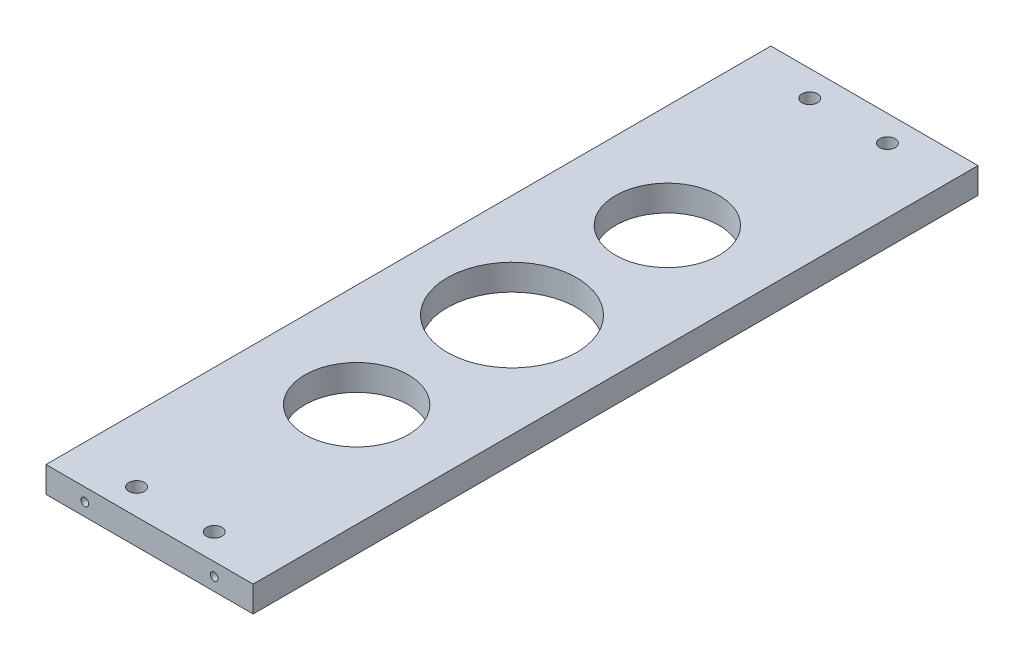
ISO-10303-21;
HEADER;
FILE_DESCRIPTION(('STEP AP214'),'2;1');
FILE_NAME('part.step','',(''),(''),'','','');
FILE_SCHEMA(('AUTOMOTIVE_DESIGN { 1 0 10303 214 1 1 1 1 }'));
ENDSEC;
DATA;
#1=APPLICATION_CONTEXT('core data for automotive mechanical design processes');
#2=APPLICATION_PROTOCOL_DEFINITION('international standard','automotive_design',2000,#1);
#3=PRODUCT_CONTEXT('',#1,'mechanical');
#4=PRODUCT('Part','Part','',(#3));
#5=PRODUCT_RELATED_PRODUCT_CATEGORY('part','',(#4));
#6=PRODUCT_DEFINITION_FORMATION('','',#4);
#7=PRODUCT_DEFINITION_CONTEXT('part definition',#1,'design');
#8=PRODUCT_DEFINITION('design','',#6,#7);
#9=PRODUCT_DEFINITION_SHAPE('','',#8);
#10=(LENGTH_UNIT() NAMED_UNIT(*) SI_UNIT(.MILLI.,.METRE.));
#11=(NAMED_UNIT(*) PLANE_ANGLE_UNIT() SI_UNIT($,.RADIAN.));
#12=(NAMED_UNIT(*) SI_UNIT($,.STERADIAN.) SOLID_ANGLE_UNIT());
#13=UNCERTAINTY_MEASURE_WITH_UNIT(LENGTH_MEASURE(1.E-05),#10,'distance_accuracy_value','');
#14=(GEOMETRIC_REPRESENTATION_CONTEXT(3) GLOBAL_UNCERTAINTY_ASSIGNED_CONTEXT((#13)) GLOBAL_UNIT_ASSIGNED_CONTEXT((#10,
#11,#12)) REPRESENTATION_CONTEXT('',''));
#15=CARTESIAN_POINT('',(0.,0.,0.));
#16=DIRECTION('',(0.,0.,1.));
#17=DIRECTION('',(1.,0.,0.));
#18=AXIS2_PLACEMENT_3D('',#15,#16,#17);
#19=CARTESIAN_POINT('',(0.,10.,-140.));
#20=DIRECTION('',(0.,0.,1.));
#21=DIRECTION('',(1.,0.,0.));
#22=AXIS2_PLACEMENT_3D('',#19,#20,#21);
#23=PLANE('',#22);
#24=CARTESIAN_POINT('',(15.,5.,-140.));
#25=DIRECTION('',(0.,0.,1.));
#26=DIRECTION('',(1.,0.,0.));
#27=AXIS2_PLACEMENT_3D('',#24,#25,#26);
#28=CIRCLE('',#27,1.5);
#29=CARTESIAN_POINT('',(16.5,5.,-140.));
#30=VERTEX_POINT('',#29);
#31=EDGE_CURVE('E222',#30,#30,#28,.T.);
#32=ORIENTED_EDGE('',*,*,#31,.T.);
#33=EDGE_LOOP('',(#32));
#34=FACE_BOUND('',#33,.T.);
#35=DIRECTION('',(-1.,0.,0.));
#36=VECTOR('',#35,1.);
#37=CARTESIAN_POINT('',(0.,0.,-140.));
#38=LINE('',#37,#36);
#39=CARTESIAN_POINT('',(80.,0.,-140.));
#40=VERTEX_POINT('',#39);
#41=CARTESIAN_POINT('',(0.,0.,-140.));
#42=VERTEX_POINT('',#41);
#43=EDGE_CURVE('E101',#40,#42,#38,.T.);
#44=ORIENTED_EDGE('',*,*,#43,.T.);
#45=DIRECTION('',(0.,-1.,0.));
#46=VECTOR('',#45,1.);
#47=CARTESIAN_POINT('',(0.,10.,-140.));
#48=LINE('',#47,#46);
#49=CARTESIAN_POINT('',(0.,10.,-140.));
#50=VERTEX_POINT('',#49);
#51=EDGE_CURVE('E93',#50,#42,#48,.T.);
#52=ORIENTED_EDGE('',*,*,#51,.F.);
#53=DIRECTION('',(-1.,0.,0.));
#54=VECTOR('',#53,1.);
#55=CARTESIAN_POINT('',(0.,10.,-140.));
#56=LINE('',#55,#54);
#57=CARTESIAN_POINT('',(80.,10.,-140.));
#58=VERTEX_POINT('',#57);
#59=EDGE_CURVE('E48',#58,#50,#56,.T.);
#60=ORIENTED_EDGE('',*,*,#59,.F.);
#61=DIRECTION('',(0.,-1.,0.));
#62=VECTOR('',#61,1.);
#63=CARTESIAN_POINT('',(80.,10.,-140.));
#64=LINE('',#63,#62);
#65=EDGE_CURVE('E90',#58,#40,#64,.T.);
#66=ORIENTED_EDGE('',*,*,#65,.T.);
#67=EDGE_LOOP('',(#44,#52,#60,#66));
#68=FACE_BOUND('',#67,.T.);
#69=CARTESIAN_POINT('',(65.,5.,-140.));
#70=DIRECTION('',(0.,0.,1.));
#71=DIRECTION('',(1.,0.,0.));
#72=AXIS2_PLACEMENT_3D('',#69,#70,#71);
#73=CIRCLE('',#72,1.5);
#74=CARTESIAN_POINT('',(66.5,5.,-140.));
#75=VERTEX_POINT('',#74);
#76=EDGE_CURVE('E227',#75,#75,#73,.T.);
#77=ORIENTED_EDGE('',*,*,#76,.T.);
#78=EDGE_LOOP('',(#77));
#79=FACE_BOUND('',#78,.T.);
#80=ADVANCED_FACE('F31',(#34,#68,#79),#23,.F.);
#81=CARTESIAN_POINT('',(-3.89437682128858E-13,10.,140.));
#82=DIRECTION('',(0.,1.,0.));
#83=DIRECTION('',(0.,0.,1.));
#84=AXIS2_PLACEMENT_3D('',#81,#82,#83);
#85=PLANE('',#84);
#86=CARTESIAN_POINT('',(40.,10.,60.));
#87=DIRECTION('',(0.,1.,0.));
#88=DIRECTION('',(0.,0.,1.));
#89=AXIS2_PLACEMENT_3D('',#86,#87,#88);
#90=CIRCLE('',#89,20.);
#91=CARTESIAN_POINT('',(40.,10.,80.));
#92=VERTEX_POINT('',#91);
#93=EDGE_CURVE('E139',#92,#92,#90,.T.);
#94=ORIENTED_EDGE('',*,*,#93,.F.);
#95=EDGE_LOOP('',(#94));
#96=FACE_BOUND('',#95,.T.);
#97=CARTESIAN_POINT('',(55.,10.,130.));
#98=DIRECTION('',(0.,1.,0.));
#99=DIRECTION('',(0.,0.,1.));
#100=AXIS2_PLACEMENT_3D('',#97,#98,#99);
#101=CIRCLE('',#100,3.);
#102=CARTESIAN_POINT('',(55.,10.,133.));
#103=VERTEX_POINT('',#102);
#104=EDGE_CURVE('E149',#103,#103,#101,.T.);
#105=ORIENTED_EDGE('',*,*,#104,.F.);
#106=EDGE_LOOP('',(#105));
#107=FACE_BOUND('',#106,.T.);
#108=CARTESIAN_POINT('',(55.,10.,-130.));
#109=DIRECTION('',(0.,1.,0.));
#110=DIRECTION('',(0.,0.,1.));
#111=AXIS2_PLACEMENT_3D('',#108,#109,#110);
#112=CIRCLE('',#111,3.);
#113=CARTESIAN_POINT('',(55.,10.,-127.));
#114=VERTEX_POINT('',#113);
#115=EDGE_CURVE('E159',#114,#114,#112,.T.);
#116=ORIENTED_EDGE('',*,*,#115,.F.);
#117=EDGE_LOOP('',(#116));
#118=FACE_BOUND('',#117,.T.);
#119=DIRECTION('',(0.,0.,1.));
#120=VECTOR('',#119,1.);
#121=CARTESIAN_POINT('',(0.,10.,-140.));
#122=LINE('',#121,#120);
#123=CARTESIAN_POINT('',(0.,10.,140.));
#124=VERTEX_POINT('',#123);
#125=EDGE_CURVE('E76',#50,#124,#122,.T.);
#126=ORIENTED_EDGE('',*,*,#125,.T.);
#127=DIRECTION('',(1.,0.,0.));
#128=VECTOR('',#127,1.);
#129=CARTESIAN_POINT('',(0.,10.,140.));
#130=LINE('',#129,#128);
#131=CARTESIAN_POINT('',(80.0000000000001,10.,140.));
#132=VERTEX_POINT('',#131);
#133=EDGE_CURVE('E79',#124,#132,#130,.T.);
#134=ORIENTED_EDGE('',*,*,#133,.T.);
#135=DIRECTION('',(0.,0.,-1.));
#136=VECTOR('',#135,1.);
#137=CARTESIAN_POINT('',(80.0000000000001,10.,110.));
#138=LINE('',#137,#136);
#139=EDGE_CURVE('E84',#132,#58,#138,.T.);
#140=ORIENTED_EDGE('',*,*,#139,.T.);
#141=ORIENTED_EDGE('',*,*,#59,.T.);
#142=EDGE_LOOP('',(#126,#134,#140,#141));
#143=FACE_BOUND('',#142,.T.);
#144=CARTESIAN_POINT('',(25.,10.,-130.));
#145=DIRECTION('',(0.,1.,0.));
#146=DIRECTION('',(0.,0.,1.));
#147=AXIS2_PLACEMENT_3D('',#144,#145,#146);
#148=CIRCLE('',#147,3.);
#149=CARTESIAN_POINT('',(25.,10.,-127.));
#150=VERTEX_POINT('',#149);
#151=EDGE_CURVE('E98',#150,#150,#148,.T.);
#152=ORIENTED_EDGE('',*,*,#151,.F.);
#153=EDGE_LOOP('',(#152));
#154=FACE_BOUND('',#153,.T.);
#155=CARTESIAN_POINT('',(25.,10.,130.));
#156=DIRECTION('',(0.,1.,0.));
#157=DIRECTION('',(0.,0.,1.));
#158=AXIS2_PLACEMENT_3D('',#155,#156,#157);
#159=CIRCLE('',#158,3.);
#160=CARTESIAN_POINT('',(25.,10.,133.));
#161=VERTEX_POINT('',#160);
#162=EDGE_CURVE('E154',#161,#161,#159,.T.);
#163=ORIENTED_EDGE('',*,*,#162,.F.);
#164=EDGE_LOOP('',(#163));
#165=FACE_BOUND('',#164,.T.);
#166=CARTESIAN_POINT('',(40.,10.,0.));
#167=DIRECTION('',(0.,1.,0.));
#168=DIRECTION('',(0.,0.,1.));
#169=AXIS2_PLACEMENT_3D('',#166,#167,#168);
#170=CIRCLE('',#169,25.);
#171=CARTESIAN_POINT('',(40.,10.,25.));
#172=VERTEX_POINT('',#171);
#173=EDGE_CURVE('E144',#172,#172,#170,.T.);
#174=ORIENTED_EDGE('',*,*,#173,.F.);
#175=EDGE_LOOP('',(#174));
#176=FACE_BOUND('',#175,.T.);
#177=CARTESIAN_POINT('',(40.,10.,-60.));
#178=DIRECTION('',(0.,1.,0.));
#179=DIRECTION('',(0.,0.,1.));
#180=AXIS2_PLACEMENT_3D('',#177,#178,#179);
#181=CIRCLE('',#180,20.);
#182=CARTESIAN_POINT('',(40.,10.,-40.));
#183=VERTEX_POINT('',#182);
#184=EDGE_CURVE('E128',#183,#183,#181,.T.);
#185=ORIENTED_EDGE('',*,*,#184,.F.);
#186=EDGE_LOOP('',(#185));
#187=FACE_BOUND('',#186,.T.);
#188=ADVANCED_FACE('F81',(#96,#107,#118,#143,#154,#165,#176,#187),#85,.T.);
#189=CARTESIAN_POINT('',(-3.89437682128858E-13,0.,140.));
#190=DIRECTION('',(0.,1.,0.));
#191=DIRECTION('',(0.,0.,1.));
#192=AXIS2_PLACEMENT_3D('',#189,#190,#191);
#193=PLANE('',#192);
#194=CARTESIAN_POINT('',(40.,0.,60.));
#195=DIRECTION('',(0.,1.,0.));
#196=DIRECTION('',(0.,0.,1.));
#197=AXIS2_PLACEMENT_3D('',#194,#195,#196);
#198=CIRCLE('',#197,20.);
#199=CARTESIAN_POINT('',(40.,0.,80.));
#200=VERTEX_POINT('',#199);
#201=EDGE_CURVE('E132',#200,#200,#198,.T.);
#202=ORIENTED_EDGE('',*,*,#201,.T.);
#203=EDGE_LOOP('',(#202));
#204=FACE_BOUND('',#203,.T.);
#205=CARTESIAN_POINT('',(55.,0.,130.));
#206=DIRECTION('',(0.,1.,0.));
#207=DIRECTION('',(0.,0.,1.));
#208=AXIS2_PLACEMENT_3D('',#205,#206,#207);
#209=CIRCLE('',#208,3.);
#210=CARTESIAN_POINT('',(55.,0.,133.));
#211=VERTEX_POINT('',#210);
#212=EDGE_CURVE('E147',#211,#211,#209,.T.);
#213=ORIENTED_EDGE('',*,*,#212,.T.);
#214=EDGE_LOOP('',(#213));
#215=FACE_BOUND('',#214,.T.);
#216=CARTESIAN_POINT('',(55.,0.,-130.));
#217=DIRECTION('',(0.,1.,0.));
#218=DIRECTION('',(0.,0.,1.));
#219=AXIS2_PLACEMENT_3D('',#216,#217,#218);
#220=CIRCLE('',#219,3.);
#221=CARTESIAN_POINT('',(55.,0.,-127.));
#222=VERTEX_POINT('',#221);
#223=EDGE_CURVE('E157',#222,#222,#220,.T.);
#224=ORIENTED_EDGE('',*,*,#223,.T.);
#225=EDGE_LOOP('',(#224));
#226=FACE_BOUND('',#225,.T.);
#227=DIRECTION('',(0.,0.,1.));
#228=VECTOR('',#227,1.);
#229=CARTESIAN_POINT('',(0.,0.,110.));
#230=LINE('',#229,#228);
#231=CARTESIAN_POINT('',(0.,0.,140.));
#232=VERTEX_POINT('',#231);
#233=EDGE_CURVE('E71',#42,#232,#230,.T.);
#234=ORIENTED_EDGE('',*,*,#233,.F.);
#235=ORIENTED_EDGE('',*,*,#43,.F.);
#236=DIRECTION('',(0.,0.,-1.));
#237=VECTOR('',#236,1.);
#238=CARTESIAN_POINT('',(80.,0.,-140.));
#239=LINE('',#238,#237);
#240=CARTESIAN_POINT('',(80.0000000000001,0.,140.));
#241=VERTEX_POINT('',#240);
#242=EDGE_CURVE('E64',#241,#40,#239,.T.);
#243=ORIENTED_EDGE('',*,*,#242,.F.);
#244=DIRECTION('',(1.,0.,0.));
#245=VECTOR('',#244,1.);
#246=CARTESIAN_POINT('',(0.,0.,140.));
#247=LINE('',#246,#245);
#248=EDGE_CURVE('E89',#232,#241,#247,.T.);
#249=ORIENTED_EDGE('',*,*,#248,.F.);
#250=EDGE_LOOP('',(#234,#235,#243,#249));
#251=FACE_BOUND('',#250,.T.);
#252=CARTESIAN_POINT('',(25.,0.,-130.));
#253=DIRECTION('',(0.,1.,0.));
#254=DIRECTION('',(0.,0.,1.));
#255=AXIS2_PLACEMENT_3D('',#252,#253,#254);
#256=CIRCLE('',#255,3.);
#257=CARTESIAN_POINT('',(25.,0.,-127.));
#258=VERTEX_POINT('',#257);
#259=EDGE_CURVE('E115',#258,#258,#256,.T.);
#260=ORIENTED_EDGE('',*,*,#259,.T.);
#261=EDGE_LOOP('',(#260));
#262=FACE_BOUND('',#261,.T.);
#263=CARTESIAN_POINT('',(25.,0.,130.));
#264=DIRECTION('',(0.,1.,0.));
#265=DIRECTION('',(0.,0.,1.));
#266=AXIS2_PLACEMENT_3D('',#263,#264,#265);
#267=CIRCLE('',#266,3.);
#268=CARTESIAN_POINT('',(25.,0.,133.));
#269=VERTEX_POINT('',#268);
#270=EDGE_CURVE('E119',#269,#269,#267,.T.);
#271=ORIENTED_EDGE('',*,*,#270,.T.);
#272=EDGE_LOOP('',(#271));
#273=FACE_BOUND('',#272,.T.);
#274=CARTESIAN_POINT('',(40.,0.,0.));
#275=DIRECTION('',(0.,1.,0.));
#276=DIRECTION('',(0.,0.,1.));
#277=AXIS2_PLACEMENT_3D('',#274,#275,#276);
#278=CIRCLE('',#277,25.);
#279=CARTESIAN_POINT('',(40.,0.,25.));
#280=VERTEX_POINT('',#279);
#281=EDGE_CURVE('E123',#280,#280,#278,.T.);
#282=ORIENTED_EDGE('',*,*,#281,.T.);
#283=EDGE_LOOP('',(#282));
#284=FACE_BOUND('',#283,.T.);
#285=CARTESIAN_POINT('',(40.,0.,-60.));
#286=DIRECTION('',(0.,1.,0.));
#287=DIRECTION('',(0.,0.,1.));
#288=AXIS2_PLACEMENT_3D('',#285,#286,#287);
#289=CIRCLE('',#288,20.);
#290=CARTESIAN_POINT('',(40.,0.,-40.));
#291=VERTEX_POINT('',#290);
#292=EDGE_CURVE('E126',#291,#291,#289,.T.);
#293=ORIENTED_EDGE('',*,*,#292,.T.);
#294=EDGE_LOOP('',(#293));
#295=FACE_BOUND('',#294,.T.);
#296=ADVANCED_FACE('F107',(#204,#215,#226,#251,#262,#273,#284,#295),#193,.F.);
#297=CARTESIAN_POINT('',(0.,10.,110.));
#298=DIRECTION('',(1.,0.,0.));
#299=DIRECTION('',(0.,0.,-1.));
#300=AXIS2_PLACEMENT_3D('',#297,#298,#299);
#301=PLANE('',#300);
#302=ORIENTED_EDGE('',*,*,#233,.T.);
#303=DIRECTION('',(0.,-1.,0.));
#304=VECTOR('',#303,1.);
#305=CARTESIAN_POINT('',(0.,10.,140.));
#306=LINE('',#305,#304);
#307=EDGE_CURVE('E11',#124,#232,#306,.T.);
#308=ORIENTED_EDGE('',*,*,#307,.F.);
#309=ORIENTED_EDGE('',*,*,#125,.F.);
#310=ORIENTED_EDGE('',*,*,#51,.T.);
#311=EDGE_LOOP('',(#302,#308,#309,#310));
#312=FACE_BOUND('',#311,.T.);
#313=ADVANCED_FACE('F33',(#312),#301,.F.);
#314=CARTESIAN_POINT('',(0.,10.,140.));
#315=DIRECTION('',(0.,0.,-1.));
#316=DIRECTION('',(-1.,0.,0.));
#317=AXIS2_PLACEMENT_3D('',#314,#315,#316);
#318=PLANE('',#317);
#319=CARTESIAN_POINT('',(65.,5.,140.));
#320=DIRECTION('',(0.,0.,1.));
#321=DIRECTION('',(1.,0.,0.));
#322=AXIS2_PLACEMENT_3D('',#319,#320,#321);
#323=CIRCLE('',#322,1.5);
#324=CARTESIAN_POINT('',(66.5,5.,140.));
#325=VERTEX_POINT('',#324);
#326=EDGE_CURVE('E212',#325,#325,#323,.T.);
#327=ORIENTED_EDGE('',*,*,#326,.F.);
#328=EDGE_LOOP('',(#327));
#329=FACE_BOUND('',#328,.T.);
#330=CARTESIAN_POINT('',(15.,5.,140.));
#331=DIRECTION('',(0.,0.,1.));
#332=DIRECTION('',(1.,0.,0.));
#333=AXIS2_PLACEMENT_3D('',#330,#331,#332);
#334=CIRCLE('',#333,1.5);
#335=CARTESIAN_POINT('',(16.5,5.,140.));
#336=VERTEX_POINT('',#335);
#337=EDGE_CURVE('E135',#336,#336,#334,.T.);
#338=ORIENTED_EDGE('',*,*,#337,.F.);
#339=EDGE_LOOP('',(#338));
#340=FACE_BOUND('',#339,.T.);
#341=ORIENTED_EDGE('',*,*,#248,.T.);
#342=DIRECTION('',(0.,-1.,0.));
#343=VECTOR('',#342,1.);
#344=CARTESIAN_POINT('',(80.0000000000001,10.,140.));
#345=LINE('',#344,#343);
#346=EDGE_CURVE('E40',#132,#241,#345,.T.);
#347=ORIENTED_EDGE('',*,*,#346,.F.);
#348=ORIENTED_EDGE('',*,*,#133,.F.);
#349=ORIENTED_EDGE('',*,*,#307,.T.);
#350=EDGE_LOOP('',(#341,#347,#348,#349));
#351=FACE_BOUND('',#350,.T.);
#352=ADVANCED_FACE('F88',(#329,#340,#351),#318,.F.);
#353=CARTESIAN_POINT('',(80.,10.,-140.));
#354=DIRECTION('',(-1.,0.,0.));
#355=DIRECTION('',(0.,0.,1.));
#356=AXIS2_PLACEMENT_3D('',#353,#354,#355);
#357=PLANE('',#356);
#358=ORIENTED_EDGE('',*,*,#242,.T.);
#359=ORIENTED_EDGE('',*,*,#65,.F.);
#360=ORIENTED_EDGE('',*,*,#139,.F.);
#361=ORIENTED_EDGE('',*,*,#346,.T.);
#362=EDGE_LOOP('',(#358,#359,#360,#361));
#363=FACE_BOUND('',#362,.T.);
#364=ADVANCED_FACE('F91',(#363),#357,.F.);
#365=CARTESIAN_POINT('',(25.,10.,-130.));
#366=DIRECTION('',(0.,-1.,0.));
#367=DIRECTION('',(0.,0.,-1.));
#368=AXIS2_PLACEMENT_3D('',#365,#366,#367);
#369=CYLINDRICAL_SURFACE('',#368,3.);
#370=ORIENTED_EDGE('',*,*,#151,.T.);
#371=EDGE_LOOP('',(#370));
#372=FACE_BOUND('',#371,.T.);
#373=ORIENTED_EDGE('',*,*,#259,.F.);
#374=EDGE_LOOP('',(#373));
#375=FACE_BOUND('',#374,.T.);
#376=ADVANCED_FACE('F168',(#372,#375),#369,.F.);
#377=CARTESIAN_POINT('',(55.,10.,-130.));
#378=DIRECTION('',(0.,-1.,0.));
#379=DIRECTION('',(0.,0.,-1.));
#380=AXIS2_PLACEMENT_3D('',#377,#378,#379);
#381=CYLINDRICAL_SURFACE('',#380,3.);
#382=ORIENTED_EDGE('',*,*,#115,.T.);
#383=EDGE_LOOP('',(#382));
#384=FACE_BOUND('',#383,.T.);
#385=ORIENTED_EDGE('',*,*,#223,.F.);
#386=EDGE_LOOP('',(#385));
#387=FACE_BOUND('',#386,.T.);
#388=ADVANCED_FACE('F346',(#384,#387),#381,.F.);
#389=CARTESIAN_POINT('',(25.,10.,130.));
#390=DIRECTION('',(0.,-1.,0.));
#391=DIRECTION('',(0.,0.,-1.));
#392=AXIS2_PLACEMENT_3D('',#389,#390,#391);
#393=CYLINDRICAL_SURFACE('',#392,3.);
#394=ORIENTED_EDGE('',*,*,#162,.T.);
#395=EDGE_LOOP('',(#394));
#396=FACE_BOUND('',#395,.T.);
#397=ORIENTED_EDGE('',*,*,#270,.F.);
#398=EDGE_LOOP('',(#397));
#399=FACE_BOUND('',#398,.T.);
#400=ADVANCED_FACE('F337',(#396,#399),#393,.F.);
#401=CARTESIAN_POINT('',(55.,10.,130.));
#402=DIRECTION('',(0.,-1.,0.));
#403=DIRECTION('',(0.,0.,-1.));
#404=AXIS2_PLACEMENT_3D('',#401,#402,#403);
#405=CYLINDRICAL_SURFACE('',#404,3.);
#406=ORIENTED_EDGE('',*,*,#104,.T.);
#407=EDGE_LOOP('',(#406));
#408=FACE_BOUND('',#407,.T.);
#409=ORIENTED_EDGE('',*,*,#212,.F.);
#410=EDGE_LOOP('',(#409));
#411=FACE_BOUND('',#410,.T.);
#412=ADVANCED_FACE('F328',(#408,#411),#405,.F.);
#413=CARTESIAN_POINT('',(40.,10.,0.));
#414=DIRECTION('',(0.,-1.,0.));
#415=DIRECTION('',(0.,0.,-1.));
#416=AXIS2_PLACEMENT_3D('',#413,#414,#415);
#417=CYLINDRICAL_SURFACE('',#416,25.);
#418=ORIENTED_EDGE('',*,*,#173,.T.);
#419=EDGE_LOOP('',(#418));
#420=FACE_BOUND('',#419,.T.);
#421=ORIENTED_EDGE('',*,*,#281,.F.);
#422=EDGE_LOOP('',(#421));
#423=FACE_BOUND('',#422,.T.);
#424=ADVANCED_FACE('F192',(#420,#423),#417,.F.);
#425=CARTESIAN_POINT('',(40.,10.,60.));
#426=DIRECTION('',(0.,-1.,0.));
#427=DIRECTION('',(0.,0.,-1.));
#428=AXIS2_PLACEMENT_3D('',#425,#426,#427);
#429=CYLINDRICAL_SURFACE('',#428,20.);
#430=ORIENTED_EDGE('',*,*,#93,.T.);
#431=EDGE_LOOP('',(#430));
#432=FACE_BOUND('',#431,.T.);
#433=ORIENTED_EDGE('',*,*,#201,.F.);
#434=EDGE_LOOP('',(#433));
#435=FACE_BOUND('',#434,.T.);
#436=ADVANCED_FACE('F183',(#432,#435),#429,.F.);
#437=CARTESIAN_POINT('',(40.,10.,-60.));
#438=DIRECTION('',(0.,-1.,0.));
#439=DIRECTION('',(0.,0.,-1.));
#440=AXIS2_PLACEMENT_3D('',#437,#438,#439);
#441=CYLINDRICAL_SURFACE('',#440,20.);
#442=ORIENTED_EDGE('',*,*,#184,.T.);
#443=EDGE_LOOP('',(#442));
#444=FACE_BOUND('',#443,.T.);
#445=ORIENTED_EDGE('',*,*,#292,.F.);
#446=EDGE_LOOP('',(#445));
#447=FACE_BOUND('',#446,.T.);
#448=ADVANCED_FACE('F180',(#444,#447),#441,.F.);
#449=CARTESIAN_POINT('',(15.,5.,125.));
#450=DIRECTION('',(0.,0.,1.));
#451=DIRECTION('',(1.,0.,0.));
#452=AXIS2_PLACEMENT_3D('',#449,#450,#451);
#453=CYLINDRICAL_SURFACE('',#452,1.5);
#454=CARTESIAN_POINT('',(15.,5.,125.));
#455=DIRECTION('',(0.,0.,1.));
#456=DIRECTION('',(1.,0.,0.));
#457=AXIS2_PLACEMENT_3D('',#454,#455,#456);
#458=CIRCLE('',#457,1.5);
#459=CARTESIAN_POINT('',(16.5,5.,125.));
#460=VERTEX_POINT('',#459);
#461=EDGE_CURVE('E129',#460,#460,#458,.T.);
#462=ORIENTED_EDGE('',*,*,#461,.F.);
#463=EDGE_LOOP('',(#462));
#464=FACE_BOUND('',#463,.T.);
#465=ORIENTED_EDGE('',*,*,#337,.T.);
#466=EDGE_LOOP('',(#465));
#467=FACE_BOUND('',#466,.T.);
#468=ADVANCED_FACE('F182',(#464,#467),#453,.F.);
#469=CARTESIAN_POINT('',(15.,5.,125.));
#470=DIRECTION('',(0.,0.,1.));
#471=DIRECTION('',(1.,0.,0.));
#472=AXIS2_PLACEMENT_3D('',#469,#470,#471);
#473=PLANE('',#472);
#474=ORIENTED_EDGE('',*,*,#461,.T.);
#475=EDGE_LOOP('',(#474));
#476=FACE_BOUND('',#475,.T.);
#477=ADVANCED_FACE('F189',(#476),#473,.T.);
#478=CARTESIAN_POINT('',(65.,5.,125.));
#479=DIRECTION('',(0.,0.,1.));
#480=DIRECTION('',(1.,0.,0.));
#481=AXIS2_PLACEMENT_3D('',#478,#479,#480);
#482=CYLINDRICAL_SURFACE('',#481,1.5);
#483=CARTESIAN_POINT('',(65.,5.,125.));
#484=DIRECTION('',(0.,0.,1.));
#485=DIRECTION('',(1.,0.,0.));
#486=AXIS2_PLACEMENT_3D('',#483,#484,#485);
#487=CIRCLE('',#486,1.5);
#488=CARTESIAN_POINT('',(66.5,5.,125.));
#489=VERTEX_POINT('',#488);
#490=EDGE_CURVE('E216',#489,#489,#487,.T.);
#491=ORIENTED_EDGE('',*,*,#490,.F.);
#492=EDGE_LOOP('',(#491));
#493=FACE_BOUND('',#492,.T.);
#494=ORIENTED_EDGE('',*,*,#326,.T.);
#495=EDGE_LOOP('',(#494));
#496=FACE_BOUND('',#495,.T.);
#497=ADVANCED_FACE('F255',(#493,#496),#482,.F.);
#498=CARTESIAN_POINT('',(65.,5.,125.));
#499=DIRECTION('',(0.,0.,1.));
#500=DIRECTION('',(1.,0.,0.));
#501=AXIS2_PLACEMENT_3D('',#498,#499,#500);
#502=PLANE('',#501);
#503=ORIENTED_EDGE('',*,*,#490,.T.);
#504=EDGE_LOOP('',(#503));
#505=FACE_BOUND('',#504,.T.);
#506=ADVANCED_FACE('F251',(#505),#502,.T.);
#507=CARTESIAN_POINT('',(15.,5.,-125.));
#508=DIRECTION('',(0.,0.,-1.));
#509=DIRECTION('',(-1.,0.,0.));
#510=AXIS2_PLACEMENT_3D('',#507,#508,#509);
#511=CYLINDRICAL_SURFACE('',#510,1.5);
#512=CARTESIAN_POINT('',(15.,5.,-125.));
#513=DIRECTION('',(0.,0.,1.));
#514=DIRECTION('',(1.,0.,0.));
#515=AXIS2_PLACEMENT_3D('',#512,#513,#514);
#516=CIRCLE('',#515,1.5);
#517=CARTESIAN_POINT('',(16.5,5.,-125.));
#518=VERTEX_POINT('',#517);
#519=EDGE_CURVE('E220',#518,#518,#516,.T.);
#520=ORIENTED_EDGE('',*,*,#519,.T.);
#521=EDGE_LOOP('',(#520));
#522=FACE_BOUND('',#521,.T.);
#523=ORIENTED_EDGE('',*,*,#31,.F.);
#524=EDGE_LOOP('',(#523));
#525=FACE_BOUND('',#524,.T.);
#526=ADVANCED_FACE('F247',(#522,#525),#511,.F.);
#527=CARTESIAN_POINT('',(15.,5.,-125.));
#528=DIRECTION('',(0.,0.,-1.));
#529=DIRECTION('',(1.,0.,0.));
#530=AXIS2_PLACEMENT_3D('',#527,#528,#529);
#531=PLANE('',#530);
#532=ORIENTED_EDGE('',*,*,#519,.F.);
#533=EDGE_LOOP('',(#532));
#534=FACE_BOUND('',#533,.T.);
#535=ADVANCED_FACE('F242',(#534),#531,.T.);
#536=CARTESIAN_POINT('',(65.,5.,-125.));
#537=DIRECTION('',(0.,0.,-1.));
#538=DIRECTION('',(-1.,0.,0.));
#539=AXIS2_PLACEMENT_3D('',#536,#537,#538);
#540=CYLINDRICAL_SURFACE('',#539,1.5);
#541=CARTESIAN_POINT('',(65.,5.,-125.));
#542=DIRECTION('',(0.,0.,1.));
#543=DIRECTION('',(1.,0.,0.));
#544=AXIS2_PLACEMENT_3D('',#541,#542,#543);
#545=CIRCLE('',#544,1.5);
#546=CARTESIAN_POINT('',(66.5,5.,-125.));
#547=VERTEX_POINT('',#546);
#548=EDGE_CURVE('E224',#547,#547,#545,.T.);
#549=ORIENTED_EDGE('',*,*,#548,.T.);
#550=EDGE_LOOP('',(#549));
#551=FACE_BOUND('',#550,.T.);
#552=ORIENTED_EDGE('',*,*,#76,.F.);
#553=EDGE_LOOP('',(#552));
#554=FACE_BOUND('',#553,.T.);
#555=ADVANCED_FACE('F233',(#551,#554),#540,.F.);
#556=CARTESIAN_POINT('',(65.,5.,-125.));
#557=DIRECTION('',(0.,0.,-1.));
#558=DIRECTION('',(1.,0.,0.));
#559=AXIS2_PLACEMENT_3D('',#556,#557,#558);
#560=PLANE('',#559);
#561=ORIENTED_EDGE('',*,*,#548,.F.);
#562=EDGE_LOOP('',(#561));
#563=FACE_BOUND('',#562,.T.);
#564=ADVANCED_FACE('F236',(#563),#560,.T.);
#565=CLOSED_SHELL('',(#80,#188,#296,#313,#352,#364,#376,#388,#400,#412,#424,#436,#448,#468,#477,
#497,#506,#526,#535,#555,#564));
#566=MANIFOLD_SOLID_BREP('B2',#565);
#567=ADVANCED_BREP_SHAPE_REPRESENTATION('',(#18,#566),#14);
#568=SHAPE_DEFINITION_REPRESENTATION(#9,#567);
ENDSEC;
END-ISO-10303-21;
